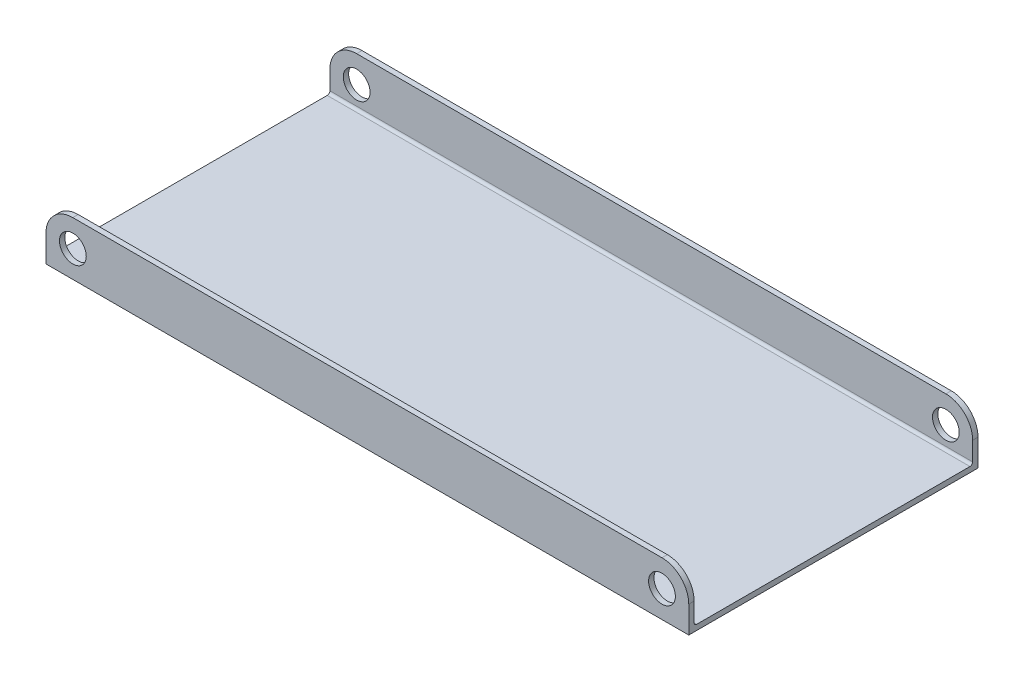
ISO-10303-21;
HEADER;
FILE_DESCRIPTION(('STEP AP214'),'2;1');
FILE_NAME('part.step','',(''),(''),'','','');
FILE_SCHEMA(('AUTOMOTIVE_DESIGN { 1 0 10303 214 1 1 1 1 }'));
ENDSEC;
DATA;
#1=APPLICATION_CONTEXT('core data for automotive mechanical design processes');
#2=APPLICATION_PROTOCOL_DEFINITION('international standard','automotive_design',2000,#1);
#3=PRODUCT_CONTEXT('',#1,'mechanical');
#4=PRODUCT('Part','Part','',(#3));
#5=PRODUCT_RELATED_PRODUCT_CATEGORY('part','',(#4));
#6=PRODUCT_DEFINITION_FORMATION('','',#4);
#7=PRODUCT_DEFINITION_CONTEXT('part definition',#1,'design');
#8=PRODUCT_DEFINITION('design','',#6,#7);
#9=PRODUCT_DEFINITION_SHAPE('','',#8);
#10=(LENGTH_UNIT() NAMED_UNIT(*) SI_UNIT(.MILLI.,.METRE.));
#11=(NAMED_UNIT(*) PLANE_ANGLE_UNIT() SI_UNIT($,.RADIAN.));
#12=(NAMED_UNIT(*) SI_UNIT($,.STERADIAN.) SOLID_ANGLE_UNIT());
#13=UNCERTAINTY_MEASURE_WITH_UNIT(LENGTH_MEASURE(1.E-05),#10,'distance_accuracy_value','');
#14=(GEOMETRIC_REPRESENTATION_CONTEXT(3) GLOBAL_UNCERTAINTY_ASSIGNED_CONTEXT((#13)) GLOBAL_UNIT_ASSIGNED_CONTEXT((#10,
#11,#12)) REPRESENTATION_CONTEXT('',''));
#15=CARTESIAN_POINT('',(0.,0.,0.));
#16=DIRECTION('',(0.,0.,1.));
#17=DIRECTION('',(1.,0.,0.));
#18=AXIS2_PLACEMENT_3D('',#15,#16,#17);
#19=CARTESIAN_POINT('',(0.,12.7,-1.27));
#20=DIRECTION('',(0.,0.,-1.));
#21=DIRECTION('',(-1.,0.,0.));
#22=AXIS2_PLACEMENT_3D('',#19,#20,#21);
#23=PLANE('',#22);
#24=CARTESIAN_POINT('',(6.37364391983117,6.35,-1.26999999999999));
#25=DIRECTION('',(0.,0.,-1.));
#26=DIRECTION('',(-1.,0.,0.));
#27=AXIS2_PLACEMENT_3D('',#24,#25,#26);
#28=CIRCLE('',#27,3.175);
#29=CARTESIAN_POINT('',(3.19864391983117,6.35,-1.26999999999999));
#30=VERTEX_POINT('',#29);
#31=EDGE_CURVE('E214',#30,#30,#28,.T.);
#32=ORIENTED_EDGE('',*,*,#31,.F.);
#33=EDGE_LOOP('',(#32));
#34=FACE_BOUND('',#33,.T.);
#35=CARTESIAN_POINT('',(146.05,6.35,-1.26999999999999));
#36=DIRECTION('',(0.,0.,-1.));
#37=DIRECTION('',(-1.,0.,0.));
#38=AXIS2_PLACEMENT_3D('',#35,#36,#37);
#39=CIRCLE('',#38,3.175);
#40=CARTESIAN_POINT('',(142.875,6.35,-1.26999999999999));
#41=VERTEX_POINT('',#40);
#42=EDGE_CURVE('E207',#41,#41,#39,.T.);
#43=ORIENTED_EDGE('',*,*,#42,.F.);
#44=EDGE_LOOP('',(#43));
#45=FACE_BOUND('',#44,.T.);
#46=DIRECTION('',(0.,-1.,0.));
#47=VECTOR('',#46,1.);
#48=CARTESIAN_POINT('',(152.4,12.7,-1.27));
#49=LINE('',#48,#47);
#50=CARTESIAN_POINT('',(152.4,6.35,-1.27));
#51=VERTEX_POINT('',#50);
#52=CARTESIAN_POINT('',(152.4,1.905,-1.27));
#53=VERTEX_POINT('',#52);
#54=EDGE_CURVE('E232',#51,#53,#49,.T.);
#55=ORIENTED_EDGE('',*,*,#54,.T.);
#56=DIRECTION('',(1.,0.,0.));
#57=VECTOR('',#56,1.);
#58=CARTESIAN_POINT('',(0.,1.905,-1.27));
#59=LINE('',#58,#57);
#60=CARTESIAN_POINT('',(0.,1.905,-1.27));
#61=VERTEX_POINT('',#60);
#62=EDGE_CURVE('E307',#53,#61,#59,.F.);
#63=ORIENTED_EDGE('',*,*,#62,.T.);
#64=DIRECTION('',(0.,-1.,0.));
#65=VECTOR('',#64,1.);
#66=CARTESIAN_POINT('',(0.,12.7,-1.27));
#67=LINE('',#66,#65);
#68=CARTESIAN_POINT('',(0.,6.35,-1.27));
#69=VERTEX_POINT('',#68);
#70=EDGE_CURVE('E245',#69,#61,#67,.T.);
#71=ORIENTED_EDGE('',*,*,#70,.F.);
#72=CARTESIAN_POINT('',(6.35,6.35,-1.27));
#73=DIRECTION('',(0.,0.,-1.));
#74=DIRECTION('',(-1.,0.,0.));
#75=AXIS2_PLACEMENT_3D('',#72,#73,#74);
#76=CIRCLE('',#75,6.35);
#77=CARTESIAN_POINT('',(6.35,12.7,-1.27));
#78=VERTEX_POINT('',#77);
#79=EDGE_CURVE('E260',#69,#78,#76,.T.);
#80=ORIENTED_EDGE('',*,*,#79,.T.);
#81=DIRECTION('',(1.,0.,0.));
#82=VECTOR('',#81,1.);
#83=CARTESIAN_POINT('',(0.,12.7,-1.27));
#84=LINE('',#83,#82);
#85=CARTESIAN_POINT('',(146.05,12.7,-1.27));
#86=VERTEX_POINT('',#85);
#87=EDGE_CURVE('E173',#78,#86,#84,.T.);
#88=ORIENTED_EDGE('',*,*,#87,.T.);
#89=CARTESIAN_POINT('',(146.05,6.35,-1.27));
#90=DIRECTION('',(0.,0.,-1.));
#91=DIRECTION('',(-1.,0.,0.));
#92=AXIS2_PLACEMENT_3D('',#89,#90,#91);
#93=CIRCLE('',#92,6.35);
#94=EDGE_CURVE('E257',#86,#51,#93,.T.);
#95=ORIENTED_EDGE('',*,*,#94,.T.);
#96=EDGE_LOOP('',(#55,#63,#71,#80,#88,#95));
#97=FACE_BOUND('',#96,.T.);
#98=ADVANCED_FACE('F47',(#34,#45,#97),#23,.T.);
#99=CARTESIAN_POINT('',(0.,12.7,0.));
#100=DIRECTION('',(-1.,0.,0.));
#101=DIRECTION('',(0.,0.,1.));
#102=AXIS2_PLACEMENT_3D('',#99,#100,#101);
#103=PLANE('',#102);
#104=DIRECTION('',(0.,-1.,0.));
#105=VECTOR('',#104,1.);
#106=CARTESIAN_POINT('',(0.,12.7,0.));
#107=LINE('',#106,#105);
#108=CARTESIAN_POINT('',(0.,6.35,0.));
#109=VERTEX_POINT('',#108);
#110=CARTESIAN_POINT('',(0.,0.,0.));
#111=VERTEX_POINT('',#110);
#112=EDGE_CURVE('E242',#109,#111,#107,.T.);
#113=ORIENTED_EDGE('',*,*,#112,.F.);
#114=DIRECTION('',(0.,0.,-1.));
#115=VECTOR('',#114,1.);
#116=CARTESIAN_POINT('',(0.,6.35,0.));
#117=LINE('',#116,#115);
#118=EDGE_CURVE('E253',#109,#69,#117,.T.);
#119=ORIENTED_EDGE('',*,*,#118,.T.);
#120=ORIENTED_EDGE('',*,*,#70,.T.);
#121=CARTESIAN_POINT('',(0.,1.905,-1.905));
#122=DIRECTION('',(-1.,0.,0.));
#123=DIRECTION('',(0.,0.,1.));
#124=AXIS2_PLACEMENT_3D('',#121,#122,#123);
#125=CIRCLE('',#124,0.635);
#126=CARTESIAN_POINT('',(0.,1.27,-1.905));
#127=VERTEX_POINT('',#126);
#128=EDGE_CURVE('E316',#61,#127,#125,.F.);
#129=ORIENTED_EDGE('',*,*,#128,.T.);
#130=DIRECTION('',(0.,0.,-1.));
#131=VECTOR('',#130,1.);
#132=CARTESIAN_POINT('',(0.,1.27,0.));
#133=LINE('',#132,#131);
#134=CARTESIAN_POINT('',(0.,1.27,-66.675));
#135=VERTEX_POINT('',#134);
#136=EDGE_CURVE('E218',#127,#135,#133,.T.);
#137=ORIENTED_EDGE('',*,*,#136,.T.);
#138=CARTESIAN_POINT('',(0.,1.905,-66.675));
#139=DIRECTION('',(-1.,0.,0.));
#140=DIRECTION('',(0.,0.,1.));
#141=AXIS2_PLACEMENT_3D('',#138,#139,#140);
#142=CIRCLE('',#141,0.635);
#143=CARTESIAN_POINT('',(0.,1.905,-67.31));
#144=VERTEX_POINT('',#143);
#145=EDGE_CURVE('E11',#135,#144,#142,.F.);
#146=ORIENTED_EDGE('',*,*,#145,.T.);
#147=DIRECTION('',(0.,-1.,0.));
#148=VECTOR('',#147,1.);
#149=CARTESIAN_POINT('',(0.,12.7,-67.31));
#150=LINE('',#149,#148);
#151=CARTESIAN_POINT('',(0.,6.35,-67.31));
#152=VERTEX_POINT('',#151);
#153=EDGE_CURVE('E199',#152,#144,#150,.T.);
#154=ORIENTED_EDGE('',*,*,#153,.F.);
#155=DIRECTION('',(0.,0.,-1.));
#156=VECTOR('',#155,1.);
#157=CARTESIAN_POINT('',(0.,6.35,0.));
#158=LINE('',#157,#156);
#159=CARTESIAN_POINT('',(0.,6.35,-68.58));
#160=VERTEX_POINT('',#159);
#161=EDGE_CURVE('E249',#152,#160,#158,.T.);
#162=ORIENTED_EDGE('',*,*,#161,.T.);
#163=DIRECTION('',(0.,-1.,0.));
#164=VECTOR('',#163,1.);
#165=CARTESIAN_POINT('',(0.,12.7,-68.58));
#166=LINE('',#165,#164);
#167=CARTESIAN_POINT('',(0.,0.,-68.58));
#168=VERTEX_POINT('',#167);
#169=EDGE_CURVE('E161',#160,#168,#166,.T.);
#170=ORIENTED_EDGE('',*,*,#169,.T.);
#171=DIRECTION('',(0.,0.,-1.));
#172=VECTOR('',#171,1.);
#173=CARTESIAN_POINT('',(0.,0.,0.));
#174=LINE('',#173,#172);
#175=EDGE_CURVE('E179',#111,#168,#174,.T.);
#176=ORIENTED_EDGE('',*,*,#175,.F.);
#177=EDGE_LOOP('',(#113,#119,#120,#129,#137,#146,#154,#162,#170,#176));
#178=FACE_BOUND('',#177,.T.);
#179=ADVANCED_FACE('F332',(#178),#103,.T.);
#180=CARTESIAN_POINT('',(0.,12.7,0.));
#181=DIRECTION('',(0.,0.,-1.));
#182=DIRECTION('',(-1.,0.,0.));
#183=AXIS2_PLACEMENT_3D('',#180,#181,#182);
#184=PLANE('',#183);
#185=CARTESIAN_POINT('',(6.37364391983117,6.35,0.));
#186=DIRECTION('',(0.,0.,1.));
#187=DIRECTION('',(1.,0.,0.));
#188=AXIS2_PLACEMENT_3D('',#185,#186,#187);
#189=CIRCLE('',#188,3.175);
#190=CARTESIAN_POINT('',(9.54864391983117,6.35,0.));
#191=VERTEX_POINT('',#190);
#192=EDGE_CURVE('E203',#191,#191,#189,.T.);
#193=ORIENTED_EDGE('',*,*,#192,.F.);
#194=EDGE_LOOP('',(#193));
#195=FACE_BOUND('',#194,.T.);
#196=CARTESIAN_POINT('',(146.05,6.35,0.));
#197=DIRECTION('',(0.,0.,1.));
#198=DIRECTION('',(1.,0.,0.));
#199=AXIS2_PLACEMENT_3D('',#196,#197,#198);
#200=CIRCLE('',#199,3.175);
#201=CARTESIAN_POINT('',(149.225,6.35,0.));
#202=VERTEX_POINT('',#201);
#203=EDGE_CURVE('E202',#202,#202,#200,.T.);
#204=ORIENTED_EDGE('',*,*,#203,.F.);
#205=EDGE_LOOP('',(#204));
#206=FACE_BOUND('',#205,.T.);
#207=DIRECTION('',(1.,0.,0.));
#208=VECTOR('',#207,1.);
#209=CARTESIAN_POINT('',(0.,12.7,0.));
#210=LINE('',#209,#208);
#211=CARTESIAN_POINT('',(6.35,12.7,0.));
#212=VERTEX_POINT('',#211);
#213=CARTESIAN_POINT('',(146.05,12.7,0.));
#214=VERTEX_POINT('',#213);
#215=EDGE_CURVE('E228',#212,#214,#210,.T.);
#216=ORIENTED_EDGE('',*,*,#215,.F.);
#217=CARTESIAN_POINT('',(6.35,6.35,0.));
#218=DIRECTION('',(0.,0.,-1.));
#219=DIRECTION('',(-1.,0.,0.));
#220=AXIS2_PLACEMENT_3D('',#217,#218,#219);
#221=CIRCLE('',#220,6.35);
#222=EDGE_CURVE('E273',#212,#109,#221,.F.);
#223=ORIENTED_EDGE('',*,*,#222,.T.);
#224=ORIENTED_EDGE('',*,*,#112,.T.);
#225=DIRECTION('',(1.,0.,0.));
#226=VECTOR('',#225,1.);
#227=CARTESIAN_POINT('',(0.,0.,0.));
#228=LINE('',#227,#226);
#229=CARTESIAN_POINT('',(152.4,0.,0.));
#230=VERTEX_POINT('',#229);
#231=EDGE_CURVE('E174',#111,#230,#228,.T.);
#232=ORIENTED_EDGE('',*,*,#231,.T.);
#233=DIRECTION('',(0.,-1.,0.));
#234=VECTOR('',#233,1.);
#235=CARTESIAN_POINT('',(152.4,12.7,0.));
#236=LINE('',#235,#234);
#237=CARTESIAN_POINT('',(152.4,6.35,0.));
#238=VERTEX_POINT('',#237);
#239=EDGE_CURVE('E168',#238,#230,#236,.T.);
#240=ORIENTED_EDGE('',*,*,#239,.F.);
#241=CARTESIAN_POINT('',(146.05,6.35,0.));
#242=DIRECTION('',(0.,0.,-1.));
#243=DIRECTION('',(-1.,0.,0.));
#244=AXIS2_PLACEMENT_3D('',#241,#242,#243);
#245=CIRCLE('',#244,6.35);
#246=EDGE_CURVE('E270',#238,#214,#245,.F.);
#247=ORIENTED_EDGE('',*,*,#246,.T.);
#248=EDGE_LOOP('',(#216,#223,#224,#232,#240,#247));
#249=FACE_BOUND('',#248,.T.);
#250=ADVANCED_FACE('F361',(#195,#206,#249),#184,.F.);
#251=CARTESIAN_POINT('',(152.4,12.7,0.));
#252=DIRECTION('',(-1.,0.,0.));
#253=DIRECTION('',(0.,0.,1.));
#254=AXIS2_PLACEMENT_3D('',#251,#252,#253);
#255=PLANE('',#254);
#256=ORIENTED_EDGE('',*,*,#54,.F.);
#257=DIRECTION('',(0.,0.,-1.));
#258=VECTOR('',#257,1.);
#259=CARTESIAN_POINT('',(152.4,6.35,0.));
#260=LINE('',#259,#258);
#261=EDGE_CURVE('E279',#51,#238,#260,.F.);
#262=ORIENTED_EDGE('',*,*,#261,.T.);
#263=ORIENTED_EDGE('',*,*,#239,.T.);
#264=DIRECTION('',(0.,0.,-1.));
#265=VECTOR('',#264,1.);
#266=CARTESIAN_POINT('',(152.4,0.,0.));
#267=LINE('',#266,#265);
#268=CARTESIAN_POINT('',(152.4,0.,-68.58));
#269=VERTEX_POINT('',#268);
#270=EDGE_CURVE('E164',#230,#269,#267,.T.);
#271=ORIENTED_EDGE('',*,*,#270,.T.);
#272=DIRECTION('',(0.,-1.,0.));
#273=VECTOR('',#272,1.);
#274=CARTESIAN_POINT('',(152.4,12.7,-68.58));
#275=LINE('',#274,#273);
#276=CARTESIAN_POINT('',(152.4,6.35,-68.58));
#277=VERTEX_POINT('',#276);
#278=EDGE_CURVE('E149',#277,#269,#275,.T.);
#279=ORIENTED_EDGE('',*,*,#278,.F.);
#280=DIRECTION('',(0.,0.,-1.));
#281=VECTOR('',#280,1.);
#282=CARTESIAN_POINT('',(152.4,6.35,-67.31));
#283=LINE('',#282,#281);
#284=CARTESIAN_POINT('',(152.4,6.35,-67.31));
#285=VERTEX_POINT('',#284);
#286=EDGE_CURVE('E276',#277,#285,#283,.F.);
#287=ORIENTED_EDGE('',*,*,#286,.T.);
#288=DIRECTION('',(0.,-1.,0.));
#289=VECTOR('',#288,1.);
#290=CARTESIAN_POINT('',(152.4,12.7,-67.31));
#291=LINE('',#290,#289);
#292=CARTESIAN_POINT('',(152.4,1.905,-67.31));
#293=VERTEX_POINT('',#292);
#294=EDGE_CURVE('E160',#285,#293,#291,.T.);
#295=ORIENTED_EDGE('',*,*,#294,.T.);
#296=CARTESIAN_POINT('',(152.4,1.905,-66.675));
#297=DIRECTION('',(-1.,0.,0.));
#298=DIRECTION('',(0.,0.,1.));
#299=AXIS2_PLACEMENT_3D('',#296,#297,#298);
#300=CIRCLE('',#299,0.635);
#301=CARTESIAN_POINT('',(152.4,1.27,-66.675));
#302=VERTEX_POINT('',#301);
#303=EDGE_CURVE('E56',#293,#302,#300,.T.);
#304=ORIENTED_EDGE('',*,*,#303,.T.);
#305=DIRECTION('',(0.,0.,-1.));
#306=VECTOR('',#305,1.);
#307=CARTESIAN_POINT('',(152.4,1.27,0.));
#308=LINE('',#307,#306);
#309=CARTESIAN_POINT('',(152.4,1.27,-1.905));
#310=VERTEX_POINT('',#309);
#311=EDGE_CURVE('E221',#310,#302,#308,.T.);
#312=ORIENTED_EDGE('',*,*,#311,.F.);
#313=CARTESIAN_POINT('',(152.4,1.905,-1.905));
#314=DIRECTION('',(-1.,0.,0.));
#315=DIRECTION('',(0.,0.,1.));
#316=AXIS2_PLACEMENT_3D('',#313,#314,#315);
#317=CIRCLE('',#316,0.635);
#318=EDGE_CURVE('E313',#310,#53,#317,.T.);
#319=ORIENTED_EDGE('',*,*,#318,.T.);
#320=EDGE_LOOP('',(#256,#262,#263,#271,#279,#287,#295,#304,#312,#319));
#321=FACE_BOUND('',#320,.T.);
#322=ADVANCED_FACE('F166',(#321),#255,.F.);
#323=CARTESIAN_POINT('',(0.,12.7,0.));
#324=DIRECTION('',(0.,1.,0.));
#325=DIRECTION('',(0.,0.,1.));
#326=AXIS2_PLACEMENT_3D('',#323,#324,#325);
#327=PLANE('',#326);
#328=ORIENTED_EDGE('',*,*,#87,.F.);
#329=DIRECTION('',(0.,0.,-1.));
#330=VECTOR('',#329,1.);
#331=CARTESIAN_POINT('',(6.35,12.7,0.));
#332=LINE('',#331,#330);
#333=EDGE_CURVE('E267',#78,#212,#332,.F.);
#334=ORIENTED_EDGE('',*,*,#333,.T.);
#335=ORIENTED_EDGE('',*,*,#215,.T.);
#336=DIRECTION('',(0.,0.,-1.));
#337=VECTOR('',#336,1.);
#338=CARTESIAN_POINT('',(146.05,12.7,-1.27));
#339=LINE('',#338,#337);
#340=EDGE_CURVE('E263',#214,#86,#339,.T.);
#341=ORIENTED_EDGE('',*,*,#340,.T.);
#342=EDGE_LOOP('',(#328,#334,#335,#341));
#343=FACE_BOUND('',#342,.T.);
#344=ADVANCED_FACE('F392',(#343),#327,.T.);
#345=CARTESIAN_POINT('',(0.,0.,0.));
#346=DIRECTION('',(0.,1.,0.));
#347=DIRECTION('',(0.,0.,1.));
#348=AXIS2_PLACEMENT_3D('',#345,#346,#347);
#349=PLANE('',#348);
#350=ORIENTED_EDGE('',*,*,#175,.T.);
#351=DIRECTION('',(1.,0.,0.));
#352=VECTOR('',#351,1.);
#353=CARTESIAN_POINT('',(0.,0.,-68.58));
#354=LINE('',#353,#352);
#355=EDGE_CURVE('E155',#168,#269,#354,.T.);
#356=ORIENTED_EDGE('',*,*,#355,.T.);
#357=ORIENTED_EDGE('',*,*,#270,.F.);
#358=ORIENTED_EDGE('',*,*,#231,.F.);
#359=EDGE_LOOP('',(#350,#356,#357,#358));
#360=FACE_BOUND('',#359,.T.);
#361=ADVANCED_FACE('F177',(#360),#349,.F.);
#362=CARTESIAN_POINT('',(0.,1.27,0.));
#363=DIRECTION('',(0.,1.,0.));
#364=DIRECTION('',(0.,0.,1.));
#365=AXIS2_PLACEMENT_3D('',#362,#363,#364);
#366=PLANE('',#365);
#367=ORIENTED_EDGE('',*,*,#136,.F.);
#368=DIRECTION('',(1.,0.,0.));
#369=VECTOR('',#368,1.);
#370=CARTESIAN_POINT('',(152.4,1.27,-1.905));
#371=LINE('',#370,#369);
#372=EDGE_CURVE('E303',#127,#310,#371,.T.);
#373=ORIENTED_EDGE('',*,*,#372,.T.);
#374=ORIENTED_EDGE('',*,*,#311,.T.);
#375=DIRECTION('',(1.,0.,0.));
#376=VECTOR('',#375,1.);
#377=CARTESIAN_POINT('',(0.,1.27,-66.675));
#378=LINE('',#377,#376);
#379=EDGE_CURVE('E300',#302,#135,#378,.F.);
#380=ORIENTED_EDGE('',*,*,#379,.T.);
#381=EDGE_LOOP('',(#367,#373,#374,#380));
#382=FACE_BOUND('',#381,.T.);
#383=ADVANCED_FACE('F323',(#382),#366,.T.);
#384=CARTESIAN_POINT('',(146.05,6.35,-508.));
#385=DIRECTION('',(0.,0.,1.));
#386=DIRECTION('',(1.,0.,0.));
#387=AXIS2_PLACEMENT_3D('',#384,#385,#386);
#388=CYLINDRICAL_SURFACE('',#387,3.175);
#389=ORIENTED_EDGE('',*,*,#42,.T.);
#390=EDGE_LOOP('',(#389));
#391=FACE_BOUND('',#390,.T.);
#392=ORIENTED_EDGE('',*,*,#203,.T.);
#393=EDGE_LOOP('',(#392));
#394=FACE_BOUND('',#393,.T.);
#395=ADVANCED_FACE('F412',(#391,#394),#388,.F.);
#396=CARTESIAN_POINT('',(6.37364391983117,6.35,-508.));
#397=DIRECTION('',(0.,0.,1.));
#398=DIRECTION('',(1.,0.,0.));
#399=AXIS2_PLACEMENT_3D('',#396,#397,#398);
#400=CYLINDRICAL_SURFACE('',#399,3.175);
#401=ORIENTED_EDGE('',*,*,#31,.T.);
#402=EDGE_LOOP('',(#401));
#403=FACE_BOUND('',#402,.T.);
#404=ORIENTED_EDGE('',*,*,#192,.T.);
#405=EDGE_LOOP('',(#404));
#406=FACE_BOUND('',#405,.T.);
#407=ADVANCED_FACE('F414',(#403,#406),#400,.F.);
#408=CARTESIAN_POINT('',(0.,12.7,-67.31));
#409=DIRECTION('',(0.,0.,-1.));
#410=DIRECTION('',(-1.,0.,0.));
#411=AXIS2_PLACEMENT_3D('',#408,#409,#410);
#412=PLANE('',#411);
#413=CARTESIAN_POINT('',(6.35,6.35,-67.31));
#414=DIRECTION('',(0.,0.,-1.));
#415=DIRECTION('',(-1.,0.,0.));
#416=AXIS2_PLACEMENT_3D('',#413,#414,#415);
#417=CIRCLE('',#416,3.175);
#418=CARTESIAN_POINT('',(3.175,6.35,-67.31));
#419=VERTEX_POINT('',#418);
#420=EDGE_CURVE('E182',#419,#419,#417,.T.);
#421=ORIENTED_EDGE('',*,*,#420,.T.);
#422=EDGE_LOOP('',(#421));
#423=FACE_BOUND('',#422,.T.);
#424=CARTESIAN_POINT('',(146.05,6.35,-67.31));
#425=DIRECTION('',(0.,0.,-1.));
#426=DIRECTION('',(-1.,0.,0.));
#427=AXIS2_PLACEMENT_3D('',#424,#425,#426);
#428=CIRCLE('',#427,3.175);
#429=CARTESIAN_POINT('',(142.875,6.35,-67.31));
#430=VERTEX_POINT('',#429);
#431=EDGE_CURVE('E190',#430,#430,#428,.T.);
#432=ORIENTED_EDGE('',*,*,#431,.T.);
#433=EDGE_LOOP('',(#432));
#434=FACE_BOUND('',#433,.T.);
#435=ORIENTED_EDGE('',*,*,#153,.T.);
#436=DIRECTION('',(1.,0.,0.));
#437=VECTOR('',#436,1.);
#438=CARTESIAN_POINT('',(0.,1.905,-67.31));
#439=LINE('',#438,#437);
#440=EDGE_CURVE('E310',#144,#293,#439,.T.);
#441=ORIENTED_EDGE('',*,*,#440,.T.);
#442=ORIENTED_EDGE('',*,*,#294,.F.);
#443=CARTESIAN_POINT('',(146.05,6.35,-67.31));
#444=DIRECTION('',(0.,0.,-1.));
#445=DIRECTION('',(-1.,0.,0.));
#446=AXIS2_PLACEMENT_3D('',#443,#444,#445);
#447=CIRCLE('',#446,6.35);
#448=CARTESIAN_POINT('',(146.05,12.7,-67.31));
#449=VERTEX_POINT('',#448);
#450=EDGE_CURVE('E297',#285,#449,#447,.F.);
#451=ORIENTED_EDGE('',*,*,#450,.T.);
#452=DIRECTION('',(1.,0.,0.));
#453=VECTOR('',#452,1.);
#454=CARTESIAN_POINT('',(0.,12.7,-67.31));
#455=LINE('',#454,#453);
#456=CARTESIAN_POINT('',(6.35,12.7,-67.31));
#457=VERTEX_POINT('',#456);
#458=EDGE_CURVE('E181',#457,#449,#455,.T.);
#459=ORIENTED_EDGE('',*,*,#458,.F.);
#460=CARTESIAN_POINT('',(6.35,6.35,-67.31));
#461=DIRECTION('',(0.,0.,-1.));
#462=DIRECTION('',(-1.,0.,0.));
#463=AXIS2_PLACEMENT_3D('',#460,#461,#462);
#464=CIRCLE('',#463,6.35);
#465=EDGE_CURVE('E294',#457,#152,#464,.F.);
#466=ORIENTED_EDGE('',*,*,#465,.T.);
#467=EDGE_LOOP('',(#435,#441,#442,#451,#459,#466));
#468=FACE_BOUND('',#467,.T.);
#469=ADVANCED_FACE('F326',(#423,#434,#468),#412,.F.);
#470=CARTESIAN_POINT('',(0.,12.7,-68.58));
#471=DIRECTION('',(0.,0.,-1.));
#472=DIRECTION('',(-1.,0.,0.));
#473=AXIS2_PLACEMENT_3D('',#470,#471,#472);
#474=PLANE('',#473);
#475=CARTESIAN_POINT('',(6.35,6.35,-68.58));
#476=DIRECTION('',(0.,0.,-1.));
#477=DIRECTION('',(-1.,0.,0.));
#478=AXIS2_PLACEMENT_3D('',#475,#476,#477);
#479=CIRCLE('',#478,3.175);
#480=CARTESIAN_POINT('',(3.175,6.35,-68.58));
#481=VERTEX_POINT('',#480);
#482=EDGE_CURVE('E441',#481,#481,#479,.T.);
#483=ORIENTED_EDGE('',*,*,#482,.F.);
#484=EDGE_LOOP('',(#483));
#485=FACE_BOUND('',#484,.T.);
#486=CARTESIAN_POINT('',(146.05,6.35,-68.58));
#487=DIRECTION('',(0.,0.,-1.));
#488=DIRECTION('',(-1.,0.,0.));
#489=AXIS2_PLACEMENT_3D('',#486,#487,#488);
#490=CIRCLE('',#489,3.175);
#491=CARTESIAN_POINT('',(142.875,6.35,-68.58));
#492=VERTEX_POINT('',#491);
#493=EDGE_CURVE('E436',#492,#492,#490,.T.);
#494=ORIENTED_EDGE('',*,*,#493,.F.);
#495=EDGE_LOOP('',(#494));
#496=FACE_BOUND('',#495,.T.);
#497=DIRECTION('',(1.,0.,0.));
#498=VECTOR('',#497,1.);
#499=CARTESIAN_POINT('',(0.,12.7,-68.58));
#500=LINE('',#499,#498);
#501=CARTESIAN_POINT('',(6.35,12.7,-68.58));
#502=VERTEX_POINT('',#501);
#503=CARTESIAN_POINT('',(146.05,12.7,-68.58));
#504=VERTEX_POINT('',#503);
#505=EDGE_CURVE('E187',#502,#504,#500,.T.);
#506=ORIENTED_EDGE('',*,*,#505,.T.);
#507=CARTESIAN_POINT('',(146.05,6.35,-68.58));
#508=DIRECTION('',(0.,0.,-1.));
#509=DIRECTION('',(-1.,0.,0.));
#510=AXIS2_PLACEMENT_3D('',#507,#508,#509);
#511=CIRCLE('',#510,6.35);
#512=EDGE_CURVE('E156',#504,#277,#511,.T.);
#513=ORIENTED_EDGE('',*,*,#512,.T.);
#514=ORIENTED_EDGE('',*,*,#278,.T.);
#515=ORIENTED_EDGE('',*,*,#355,.F.);
#516=ORIENTED_EDGE('',*,*,#169,.F.);
#517=CARTESIAN_POINT('',(6.35,6.35,-68.58));
#518=DIRECTION('',(0.,0.,-1.));
#519=DIRECTION('',(-1.,0.,0.));
#520=AXIS2_PLACEMENT_3D('',#517,#518,#519);
#521=CIRCLE('',#520,6.35);
#522=EDGE_CURVE('E289',#160,#502,#521,.T.);
#523=ORIENTED_EDGE('',*,*,#522,.T.);
#524=EDGE_LOOP('',(#506,#513,#514,#515,#516,#523));
#525=FACE_BOUND('',#524,.T.);
#526=ADVANCED_FACE('F152',(#485,#496,#525),#474,.T.);
#527=CARTESIAN_POINT('',(0.,12.7,0.));
#528=DIRECTION('',(0.,1.,0.));
#529=DIRECTION('',(0.,0.,1.));
#530=AXIS2_PLACEMENT_3D('',#527,#528,#529);
#531=PLANE('',#530);
#532=ORIENTED_EDGE('',*,*,#458,.T.);
#533=DIRECTION('',(0.,0.,-1.));
#534=VECTOR('',#533,1.);
#535=CARTESIAN_POINT('',(146.05,12.7,-68.58));
#536=LINE('',#535,#534);
#537=EDGE_CURVE('E285',#449,#504,#536,.T.);
#538=ORIENTED_EDGE('',*,*,#537,.T.);
#539=ORIENTED_EDGE('',*,*,#505,.F.);
#540=DIRECTION('',(0.,0.,-1.));
#541=VECTOR('',#540,1.);
#542=CARTESIAN_POINT('',(6.35,12.7,0.));
#543=LINE('',#542,#541);
#544=EDGE_CURVE('E282',#502,#457,#543,.F.);
#545=ORIENTED_EDGE('',*,*,#544,.T.);
#546=EDGE_LOOP('',(#532,#538,#539,#545));
#547=FACE_BOUND('',#546,.T.);
#548=ADVANCED_FACE('F338',(#547),#531,.T.);
#549=CARTESIAN_POINT('',(146.05,6.35,-55.88));
#550=DIRECTION('',(0.,0.,-1.));
#551=DIRECTION('',(-1.,0.,0.));
#552=AXIS2_PLACEMENT_3D('',#549,#550,#551);
#553=CYLINDRICAL_SURFACE('',#552,3.175);
#554=ORIENTED_EDGE('',*,*,#493,.T.);
#555=EDGE_LOOP('',(#554));
#556=FACE_BOUND('',#555,.T.);
#557=ORIENTED_EDGE('',*,*,#431,.F.);
#558=EDGE_LOOP('',(#557));
#559=FACE_BOUND('',#558,.T.);
#560=ADVANCED_FACE('F374',(#556,#559),#553,.F.);
#561=CARTESIAN_POINT('',(6.35,6.35,-55.88));
#562=DIRECTION('',(0.,0.,-1.));
#563=DIRECTION('',(-1.,0.,0.));
#564=AXIS2_PLACEMENT_3D('',#561,#562,#563);
#565=CYLINDRICAL_SURFACE('',#564,3.175);
#566=ORIENTED_EDGE('',*,*,#482,.T.);
#567=EDGE_LOOP('',(#566));
#568=FACE_BOUND('',#567,.T.);
#569=ORIENTED_EDGE('',*,*,#420,.F.);
#570=EDGE_LOOP('',(#569));
#571=FACE_BOUND('',#570,.T.);
#572=ADVANCED_FACE('F368',(#568,#571),#565,.F.);
#573=CARTESIAN_POINT('',(6.35,6.35,0.));
#574=DIRECTION('',(0.,0.,-1.));
#575=DIRECTION('',(-1.,0.,0.));
#576=AXIS2_PLACEMENT_3D('',#573,#574,#575);
#577=CYLINDRICAL_SURFACE('',#576,6.35);
#578=ORIENTED_EDGE('',*,*,#222,.F.);
#579=ORIENTED_EDGE('',*,*,#333,.F.);
#580=ORIENTED_EDGE('',*,*,#79,.F.);
#581=ORIENTED_EDGE('',*,*,#118,.F.);
#582=EDGE_LOOP('',(#578,#579,#580,#581));
#583=FACE_BOUND('',#582,.T.);
#584=ADVANCED_FACE('F352',(#583),#577,.T.);
#585=CARTESIAN_POINT('',(146.05,6.35,0.));
#586=DIRECTION('',(0.,0.,1.));
#587=DIRECTION('',(1.,0.,0.));
#588=AXIS2_PLACEMENT_3D('',#585,#586,#587);
#589=CYLINDRICAL_SURFACE('',#588,6.35);
#590=ORIENTED_EDGE('',*,*,#246,.F.);
#591=ORIENTED_EDGE('',*,*,#261,.F.);
#592=ORIENTED_EDGE('',*,*,#94,.F.);
#593=ORIENTED_EDGE('',*,*,#340,.F.);
#594=EDGE_LOOP('',(#590,#591,#592,#593));
#595=FACE_BOUND('',#594,.T.);
#596=ADVANCED_FACE('F344',(#595),#589,.T.);
#597=CARTESIAN_POINT('',(146.05,6.35,0.));
#598=DIRECTION('',(0.,0.,1.));
#599=DIRECTION('',(1.,0.,0.));
#600=AXIS2_PLACEMENT_3D('',#597,#598,#599);
#601=CYLINDRICAL_SURFACE('',#600,6.35);
#602=ORIENTED_EDGE('',*,*,#450,.F.);
#603=ORIENTED_EDGE('',*,*,#286,.F.);
#604=ORIENTED_EDGE('',*,*,#512,.F.);
#605=ORIENTED_EDGE('',*,*,#537,.F.);
#606=EDGE_LOOP('',(#602,#603,#604,#605));
#607=FACE_BOUND('',#606,.T.);
#608=ADVANCED_FACE('F342',(#607),#601,.T.);
#609=CARTESIAN_POINT('',(6.35,6.35,0.));
#610=DIRECTION('',(0.,0.,-1.));
#611=DIRECTION('',(-1.,0.,0.));
#612=AXIS2_PLACEMENT_3D('',#609,#610,#611);
#613=CYLINDRICAL_SURFACE('',#612,6.35);
#614=ORIENTED_EDGE('',*,*,#465,.F.);
#615=ORIENTED_EDGE('',*,*,#544,.F.);
#616=ORIENTED_EDGE('',*,*,#522,.F.);
#617=ORIENTED_EDGE('',*,*,#161,.F.);
#618=EDGE_LOOP('',(#614,#615,#616,#617));
#619=FACE_BOUND('',#618,.T.);
#620=ADVANCED_FACE('F334',(#619),#613,.T.);
#621=CARTESIAN_POINT('',(0.,1.905,-1.905));
#622=DIRECTION('',(-1.,0.,0.));
#623=DIRECTION('',(0.,0.,1.));
#624=AXIS2_PLACEMENT_3D('',#621,#622,#623);
#625=CYLINDRICAL_SURFACE('',#624,0.635);
#626=ORIENTED_EDGE('',*,*,#128,.F.);
#627=ORIENTED_EDGE('',*,*,#62,.F.);
#628=ORIENTED_EDGE('',*,*,#318,.F.);
#629=ORIENTED_EDGE('',*,*,#372,.F.);
#630=EDGE_LOOP('',(#626,#627,#628,#629));
#631=FACE_BOUND('',#630,.T.);
#632=ADVANCED_FACE('F350',(#631),#625,.F.);
#633=CARTESIAN_POINT('',(0.,1.905,-66.675));
#634=DIRECTION('',(1.,0.,0.));
#635=DIRECTION('',(0.,0.,-1.));
#636=AXIS2_PLACEMENT_3D('',#633,#634,#635);
#637=CYLINDRICAL_SURFACE('',#636,0.635);
#638=ORIENTED_EDGE('',*,*,#145,.F.);
#639=ORIENTED_EDGE('',*,*,#379,.F.);
#640=ORIENTED_EDGE('',*,*,#303,.F.);
#641=ORIENTED_EDGE('',*,*,#440,.F.);
#642=EDGE_LOOP('',(#638,#639,#640,#641));
#643=FACE_BOUND('',#642,.T.);
#644=ADVANCED_FACE('F49',(#643),#637,.F.);
#645=CLOSED_SHELL('',(#98,#179,#250,#322,#344,#361,#383,#395,#407,#469,#526,#548,#560,#572,#584,
#596,#608,#620,#632,#644));
#646=MANIFOLD_SOLID_BREP('B2',#645);
#647=ADVANCED_BREP_SHAPE_REPRESENTATION('',(#18,#646),#14);
#648=SHAPE_DEFINITION_REPRESENTATION(#9,#647);
ENDSEC;
END-ISO-10303-21;
